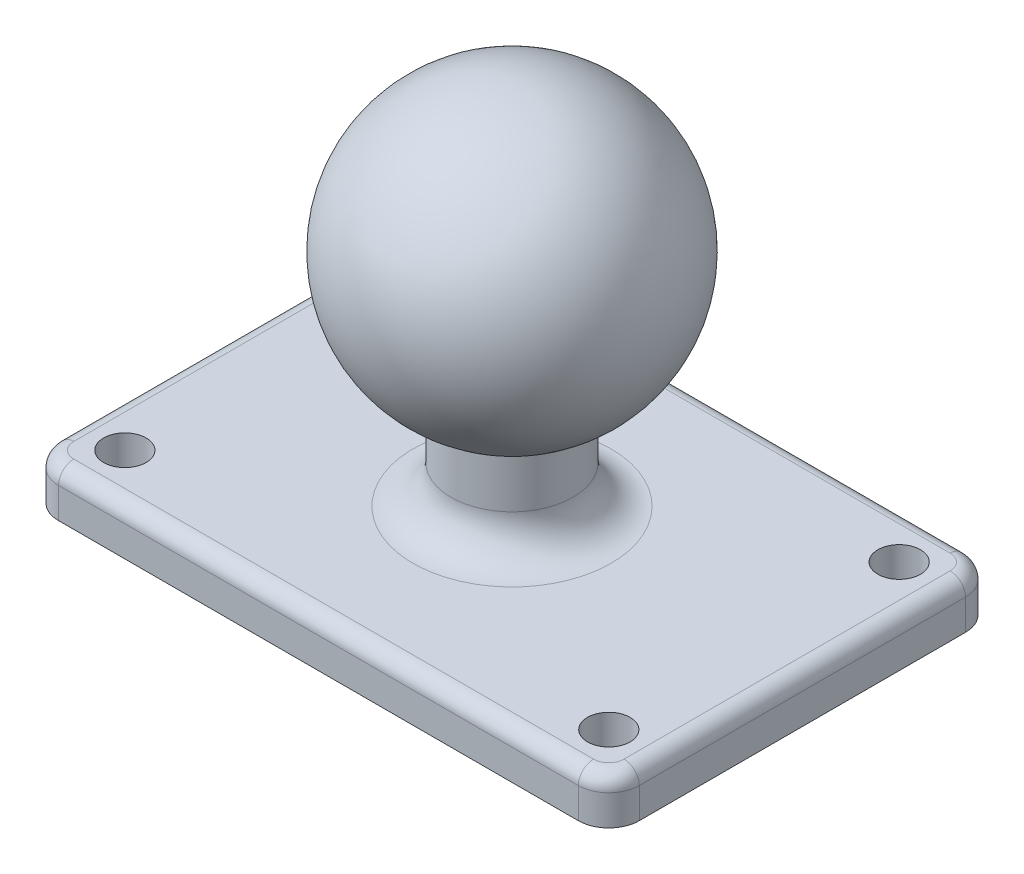
ISO-10303-21;
HEADER;
FILE_DESCRIPTION(('STEP AP214'),'2;1');
FILE_NAME('part.step','',(''),(''),'','','');
FILE_SCHEMA(('AUTOMOTIVE_DESIGN { 1 0 10303 214 1 1 1 1 }'));
ENDSEC;
DATA;
#1=APPLICATION_CONTEXT('core data for automotive mechanical design processes');
#2=APPLICATION_PROTOCOL_DEFINITION('international standard','automotive_design',2000,#1);
#3=PRODUCT_CONTEXT('',#1,'mechanical');
#4=PRODUCT('Part','Part','',(#3));
#5=PRODUCT_RELATED_PRODUCT_CATEGORY('part','',(#4));
#6=PRODUCT_DEFINITION_FORMATION('','',#4);
#7=PRODUCT_DEFINITION_CONTEXT('part definition',#1,'design');
#8=PRODUCT_DEFINITION('design','',#6,#7);
#9=PRODUCT_DEFINITION_SHAPE('','',#8);
#10=(LENGTH_UNIT() NAMED_UNIT(*) SI_UNIT(.MILLI.,.METRE.));
#11=(NAMED_UNIT(*) PLANE_ANGLE_UNIT() SI_UNIT($,.RADIAN.));
#12=(NAMED_UNIT(*) SI_UNIT($,.STERADIAN.) SOLID_ANGLE_UNIT());
#13=UNCERTAINTY_MEASURE_WITH_UNIT(LENGTH_MEASURE(1.E-05),#10,'distance_accuracy_value','');
#14=(GEOMETRIC_REPRESENTATION_CONTEXT(3) GLOBAL_UNCERTAINTY_ASSIGNED_CONTEXT((#13)) GLOBAL_UNIT_ASSIGNED_CONTEXT((#10,
#11,#12)) REPRESENTATION_CONTEXT('',''));
#15=CARTESIAN_POINT('',(0.,0.,0.));
#16=DIRECTION('',(0.,0.,1.));
#17=DIRECTION('',(1.,0.,0.));
#18=AXIS2_PLACEMENT_3D('',#15,#16,#17);
#19=CARTESIAN_POINT('',(34.1,6.,-21.4));
#20=DIRECTION('',(0.,-1.,0.));
#21=DIRECTION('',(0.,0.,-1.));
#22=AXIS2_PLACEMENT_3D('',#19,#20,#21);
#23=PLANE('',#22);
#24=DIRECTION('',(0.,0.,1.));
#25=VECTOR('',#24,1.);
#26=CARTESIAN_POINT('',(-36.1,6.,-21.4));
#27=LINE('',#26,#25);
#28=CARTESIAN_POINT('',(-36.1,6.,-21.4));
#29=VERTEX_POINT('',#28);
#30=CARTESIAN_POINT('',(-36.1,6.,21.4));
#31=VERTEX_POINT('',#30);
#32=EDGE_CURVE('E204',#29,#31,#27,.T.);
#33=ORIENTED_EDGE('',*,*,#32,.T.);
#34=CARTESIAN_POINT('',(-34.1,6.,21.4));
#35=DIRECTION('',(0.,-1.,0.));
#36=DIRECTION('',(0.,0.,-1.));
#37=AXIS2_PLACEMENT_3D('',#34,#35,#36);
#38=CIRCLE('',#37,2.);
#39=CARTESIAN_POINT('',(-34.1,6.,23.4));
#40=VERTEX_POINT('',#39);
#41=EDGE_CURVE('E206',#31,#40,#38,.F.);
#42=ORIENTED_EDGE('',*,*,#41,.T.);
#43=DIRECTION('',(1.,0.,0.));
#44=VECTOR('',#43,1.);
#45=CARTESIAN_POINT('',(34.1,6.,23.4));
#46=LINE('',#45,#44);
#47=CARTESIAN_POINT('',(34.1,6.,23.4));
#48=VERTEX_POINT('',#47);
#49=EDGE_CURVE('E192',#40,#48,#46,.T.);
#50=ORIENTED_EDGE('',*,*,#49,.T.);
#51=CARTESIAN_POINT('',(34.1,6.,21.4));
#52=DIRECTION('',(0.,-1.,0.));
#53=DIRECTION('',(0.,0.,-1.));
#54=AXIS2_PLACEMENT_3D('',#51,#52,#53);
#55=CIRCLE('',#54,2.);
#56=CARTESIAN_POINT('',(36.1,6.,21.4));
#57=VERTEX_POINT('',#56);
#58=EDGE_CURVE('E194',#48,#57,#55,.F.);
#59=ORIENTED_EDGE('',*,*,#58,.T.);
#60=DIRECTION('',(0.,0.,-1.));
#61=VECTOR('',#60,1.);
#62=CARTESIAN_POINT('',(36.1,6.,-21.4));
#63=LINE('',#62,#61);
#64=CARTESIAN_POINT('',(36.1,6.,-21.4));
#65=VERTEX_POINT('',#64);
#66=EDGE_CURVE('E196',#57,#65,#63,.T.);
#67=ORIENTED_EDGE('',*,*,#66,.T.);
#68=CARTESIAN_POINT('',(34.1,6.,-21.4));
#69=DIRECTION('',(0.,-1.,0.));
#70=DIRECTION('',(0.,0.,-1.));
#71=AXIS2_PLACEMENT_3D('',#68,#69,#70);
#72=CIRCLE('',#71,2.);
#73=CARTESIAN_POINT('',(34.1,6.,-23.4));
#74=VERTEX_POINT('',#73);
#75=EDGE_CURVE('E198',#65,#74,#72,.F.);
#76=ORIENTED_EDGE('',*,*,#75,.T.);
#77=DIRECTION('',(-1.,0.,0.));
#78=VECTOR('',#77,1.);
#79=CARTESIAN_POINT('',(34.1,6.,-23.4));
#80=LINE('',#79,#78);
#81=CARTESIAN_POINT('',(-34.1,6.,-23.4));
#82=VERTEX_POINT('',#81);
#83=EDGE_CURVE('E200',#74,#82,#80,.T.);
#84=ORIENTED_EDGE('',*,*,#83,.T.);
#85=CARTESIAN_POINT('',(-34.1,6.,-21.4));
#86=DIRECTION('',(0.,-1.,0.));
#87=DIRECTION('',(0.,0.,-1.));
#88=AXIS2_PLACEMENT_3D('',#85,#86,#87);
#89=CIRCLE('',#88,2.);
#90=EDGE_CURVE('E202',#82,#29,#89,.F.);
#91=ORIENTED_EDGE('',*,*,#90,.T.);
#92=EDGE_LOOP('',(#33,#42,#50,#59,#67,#76,#84,#91));
#93=FACE_BOUND('',#92,.T.);
#94=CARTESIAN_POINT('',(0.,6.,0.));
#95=DIRECTION('',(0.,-1.,0.));
#96=DIRECTION('',(0.,0.,-1.));
#97=AXIS2_PLACEMENT_3D('',#94,#95,#96);
#98=CIRCLE('',#97,13.);
#99=CARTESIAN_POINT('',(0.,6.,-13.));
#100=VERTEX_POINT('',#99);
#101=EDGE_CURVE('E189',#100,#100,#98,.T.);
#102=ORIENTED_EDGE('',*,*,#101,.T.);
#103=EDGE_LOOP('',(#102));
#104=FACE_BOUND('',#103,.T.);
#105=CARTESIAN_POINT('',(-31.75,6.,-19.05));
#106=DIRECTION('',(0.,1.,0.));
#107=DIRECTION('',(0.,0.,1.));
#108=AXIS2_PLACEMENT_3D('',#105,#106,#107);
#109=CIRCLE('',#108,2.794);
#110=CARTESIAN_POINT('',(-31.75,6.,-16.256));
#111=VERTEX_POINT('',#110);
#112=EDGE_CURVE('E153',#111,#111,#109,.T.);
#113=ORIENTED_EDGE('',*,*,#112,.F.);
#114=EDGE_LOOP('',(#113));
#115=FACE_BOUND('',#114,.T.);
#116=CARTESIAN_POINT('',(31.75,6.,-19.05));
#117=DIRECTION('',(0.,1.,0.));
#118=DIRECTION('',(0.,0.,1.));
#119=AXIS2_PLACEMENT_3D('',#116,#117,#118);
#120=CIRCLE('',#119,2.794);
#121=CARTESIAN_POINT('',(31.75,6.,-16.256));
#122=VERTEX_POINT('',#121);
#123=EDGE_CURVE('E264',#122,#122,#120,.T.);
#124=ORIENTED_EDGE('',*,*,#123,.F.);
#125=EDGE_LOOP('',(#124));
#126=FACE_BOUND('',#125,.T.);
#127=CARTESIAN_POINT('',(31.75,6.,19.05));
#128=DIRECTION('',(0.,1.,0.));
#129=DIRECTION('',(0.,0.,1.));
#130=AXIS2_PLACEMENT_3D('',#127,#128,#129);
#131=CIRCLE('',#130,2.794);
#132=CARTESIAN_POINT('',(31.75,6.,21.844));
#133=VERTEX_POINT('',#132);
#134=EDGE_CURVE('E258',#133,#133,#131,.T.);
#135=ORIENTED_EDGE('',*,*,#134,.F.);
#136=EDGE_LOOP('',(#135));
#137=FACE_BOUND('',#136,.T.);
#138=CARTESIAN_POINT('',(-31.75,6.,19.05));
#139=DIRECTION('',(0.,1.,0.));
#140=DIRECTION('',(0.,0.,1.));
#141=AXIS2_PLACEMENT_3D('',#138,#139,#140);
#142=CIRCLE('',#141,2.794);
#143=CARTESIAN_POINT('',(-31.75,6.,21.844));
#144=VERTEX_POINT('',#143);
#145=EDGE_CURVE('E252',#144,#144,#142,.T.);
#146=ORIENTED_EDGE('',*,*,#145,.F.);
#147=EDGE_LOOP('',(#146));
#148=FACE_BOUND('',#147,.T.);
#149=ADVANCED_FACE('F36',(#93,#104,#115,#126,#137,#148),#23,.F.);
#150=CARTESIAN_POINT('',(34.1,0.,-21.4));
#151=DIRECTION('',(0.,-1.,0.));
#152=DIRECTION('',(0.,0.,-1.));
#153=AXIS2_PLACEMENT_3D('',#150,#151,#152);
#154=PLANE('',#153);
#155=CARTESIAN_POINT('',(31.75,0.,19.05));
#156=DIRECTION('',(0.,1.,0.));
#157=DIRECTION('',(0.,0.,1.));
#158=AXIS2_PLACEMENT_3D('',#155,#156,#157);
#159=CIRCLE('',#158,2.794);
#160=CARTESIAN_POINT('',(31.75,0.,21.844));
#161=VERTEX_POINT('',#160);
#162=EDGE_CURVE('E256',#161,#161,#159,.T.);
#163=ORIENTED_EDGE('',*,*,#162,.T.);
#164=EDGE_LOOP('',(#163));
#165=FACE_BOUND('',#164,.T.);
#166=CARTESIAN_POINT('',(-31.75,0.,-19.05));
#167=DIRECTION('',(0.,1.,0.));
#168=DIRECTION('',(0.,0.,1.));
#169=AXIS2_PLACEMENT_3D('',#166,#167,#168);
#170=CIRCLE('',#169,2.794);
#171=CARTESIAN_POINT('',(-31.75,0.,-16.256));
#172=VERTEX_POINT('',#171);
#173=EDGE_CURVE('E156',#172,#172,#170,.T.);
#174=ORIENTED_EDGE('',*,*,#173,.T.);
#175=EDGE_LOOP('',(#174));
#176=FACE_BOUND('',#175,.T.);
#177=CARTESIAN_POINT('',(34.1,0.,-21.4));
#178=DIRECTION('',(0.,1.,0.));
#179=DIRECTION('',(0.,0.,-1.));
#180=AXIS2_PLACEMENT_3D('',#177,#178,#179);
#181=CIRCLE('',#180,4.);
#182=CARTESIAN_POINT('',(38.1,0.,-21.4));
#183=VERTEX_POINT('',#182);
#184=CARTESIAN_POINT('',(34.1,0.,-25.4));
#185=VERTEX_POINT('',#184);
#186=EDGE_CURVE('E145',#183,#185,#181,.T.);
#187=ORIENTED_EDGE('',*,*,#186,.F.);
#188=DIRECTION('',(0.,0.,-1.));
#189=VECTOR('',#188,1.);
#190=CARTESIAN_POINT('',(38.1,0.,21.4));
#191=LINE('',#190,#189);
#192=CARTESIAN_POINT('',(38.1,0.,21.4));
#193=VERTEX_POINT('',#192);
#194=EDGE_CURVE('E173',#193,#183,#191,.T.);
#195=ORIENTED_EDGE('',*,*,#194,.F.);
#196=CARTESIAN_POINT('',(34.1,0.,21.4));
#197=DIRECTION('',(0.,1.,0.));
#198=DIRECTION('',(0.,0.,-1.));
#199=AXIS2_PLACEMENT_3D('',#196,#197,#198);
#200=CIRCLE('',#199,4.);
#201=CARTESIAN_POINT('',(34.1,0.,25.4));
#202=VERTEX_POINT('',#201);
#203=EDGE_CURVE('E170',#202,#193,#200,.T.);
#204=ORIENTED_EDGE('',*,*,#203,.F.);
#205=DIRECTION('',(1.,0.,0.));
#206=VECTOR('',#205,1.);
#207=CARTESIAN_POINT('',(-34.1,0.,25.4));
#208=LINE('',#207,#206);
#209=CARTESIAN_POINT('',(-34.1,0.,25.4));
#210=VERTEX_POINT('',#209);
#211=EDGE_CURVE('E167',#210,#202,#208,.T.);
#212=ORIENTED_EDGE('',*,*,#211,.F.);
#213=CARTESIAN_POINT('',(-34.1,0.,21.4));
#214=DIRECTION('',(0.,1.,0.));
#215=DIRECTION('',(0.,0.,-1.));
#216=AXIS2_PLACEMENT_3D('',#213,#214,#215);
#217=CIRCLE('',#216,4.);
#218=CARTESIAN_POINT('',(-38.1,0.,21.4));
#219=VERTEX_POINT('',#218);
#220=EDGE_CURVE('E164',#219,#210,#217,.T.);
#221=ORIENTED_EDGE('',*,*,#220,.F.);
#222=DIRECTION('',(0.,0.,1.));
#223=VECTOR('',#222,1.);
#224=CARTESIAN_POINT('',(-38.1,0.,21.4));
#225=LINE('',#224,#223);
#226=CARTESIAN_POINT('',(-38.1,0.,-21.4));
#227=VERTEX_POINT('',#226);
#228=EDGE_CURVE('E161',#227,#219,#225,.T.);
#229=ORIENTED_EDGE('',*,*,#228,.F.);
#230=CARTESIAN_POINT('',(-34.1,0.,-21.4));
#231=DIRECTION('',(0.,1.,0.));
#232=DIRECTION('',(0.,0.,-1.));
#233=AXIS2_PLACEMENT_3D('',#230,#231,#232);
#234=CIRCLE('',#233,4.);
#235=CARTESIAN_POINT('',(-34.1,0.,-25.4));
#236=VERTEX_POINT('',#235);
#237=EDGE_CURVE('E148',#236,#227,#234,.T.);
#238=ORIENTED_EDGE('',*,*,#237,.F.);
#239=DIRECTION('',(-1.,0.,0.));
#240=VECTOR('',#239,1.);
#241=CARTESIAN_POINT('',(-34.1,0.,-25.4));
#242=LINE('',#241,#240);
#243=EDGE_CURVE('E130',#185,#236,#242,.T.);
#244=ORIENTED_EDGE('',*,*,#243,.F.);
#245=EDGE_LOOP('',(#187,#195,#204,#212,#221,#229,#238,#244));
#246=FACE_BOUND('',#245,.T.);
#247=CARTESIAN_POINT('',(31.75,0.,-19.05));
#248=DIRECTION('',(0.,1.,0.));
#249=DIRECTION('',(0.,0.,1.));
#250=AXIS2_PLACEMENT_3D('',#247,#248,#249);
#251=CIRCLE('',#250,2.794);
#252=CARTESIAN_POINT('',(31.75,0.,-16.256));
#253=VERTEX_POINT('',#252);
#254=EDGE_CURVE('E261',#253,#253,#251,.T.);
#255=ORIENTED_EDGE('',*,*,#254,.T.);
#256=EDGE_LOOP('',(#255));
#257=FACE_BOUND('',#256,.T.);
#258=CARTESIAN_POINT('',(-31.75,0.,19.05));
#259=DIRECTION('',(0.,1.,0.));
#260=DIRECTION('',(0.,0.,1.));
#261=AXIS2_PLACEMENT_3D('',#258,#259,#260);
#262=CIRCLE('',#261,2.794);
#263=CARTESIAN_POINT('',(-31.75,0.,21.844));
#264=VERTEX_POINT('',#263);
#265=EDGE_CURVE('E247',#264,#264,#262,.T.);
#266=ORIENTED_EDGE('',*,*,#265,.T.);
#267=EDGE_LOOP('',(#266));
#268=FACE_BOUND('',#267,.T.);
#269=ADVANCED_FACE('F142',(#165,#176,#246,#257,#268),#154,.T.);
#270=CARTESIAN_POINT('',(34.1,6.,-21.4));
#271=DIRECTION('',(0.,-1.,0.));
#272=DIRECTION('',(0.,0.,-1.));
#273=AXIS2_PLACEMENT_3D('',#270,#271,#272);
#274=CYLINDRICAL_SURFACE('',#273,4.);
#275=DIRECTION('',(0.,-1.,0.));
#276=VECTOR('',#275,1.);
#277=CARTESIAN_POINT('',(34.1,6.,-25.4));
#278=LINE('',#277,#276);
#279=CARTESIAN_POINT('',(34.1,4.,-25.4));
#280=VERTEX_POINT('',#279);
#281=EDGE_CURVE('E126',#280,#185,#278,.T.);
#282=ORIENTED_EDGE('',*,*,#281,.F.);
#283=CARTESIAN_POINT('',(34.1,4.,-21.4));
#284=DIRECTION('',(0.,-1.,0.));
#285=DIRECTION('',(0.,0.,-1.));
#286=AXIS2_PLACEMENT_3D('',#283,#284,#285);
#287=CIRCLE('',#286,4.);
#288=CARTESIAN_POINT('',(38.1,4.,-21.4));
#289=VERTEX_POINT('',#288);
#290=EDGE_CURVE('E217',#280,#289,#287,.T.);
#291=ORIENTED_EDGE('',*,*,#290,.T.);
#292=DIRECTION('',(0.,-1.,0.));
#293=VECTOR('',#292,1.);
#294=CARTESIAN_POINT('',(38.1,6.,-21.4));
#295=LINE('',#294,#293);
#296=EDGE_CURVE('E151',#289,#183,#295,.T.);
#297=ORIENTED_EDGE('',*,*,#296,.T.);
#298=ORIENTED_EDGE('',*,*,#186,.T.);
#299=EDGE_LOOP('',(#282,#291,#297,#298));
#300=FACE_BOUND('',#299,.T.);
#301=ADVANCED_FACE('F150',(#300),#274,.T.);
#302=CARTESIAN_POINT('',(-34.1,6.,-25.4));
#303=DIRECTION('',(0.,0.,1.));
#304=DIRECTION('',(1.,0.,0.));
#305=AXIS2_PLACEMENT_3D('',#302,#303,#304);
#306=PLANE('',#305);
#307=DIRECTION('',(0.,-1.,0.));
#308=VECTOR('',#307,1.);
#309=CARTESIAN_POINT('',(-34.1,6.,-25.4));
#310=LINE('',#309,#308);
#311=CARTESIAN_POINT('',(-34.1,4.,-25.4));
#312=VERTEX_POINT('',#311);
#313=EDGE_CURVE('E138',#312,#236,#310,.T.);
#314=ORIENTED_EDGE('',*,*,#313,.F.);
#315=DIRECTION('',(-1.,0.,0.));
#316=VECTOR('',#315,1.);
#317=CARTESIAN_POINT('',(-34.1,4.,-25.4));
#318=LINE('',#317,#316);
#319=EDGE_CURVE('E133',#312,#280,#318,.F.);
#320=ORIENTED_EDGE('',*,*,#319,.T.);
#321=ORIENTED_EDGE('',*,*,#281,.T.);
#322=ORIENTED_EDGE('',*,*,#243,.T.);
#323=EDGE_LOOP('',(#314,#320,#321,#322));
#324=FACE_BOUND('',#323,.T.);
#325=ADVANCED_FACE('F129',(#324),#306,.F.);
#326=CARTESIAN_POINT('',(-34.1,6.,-21.4));
#327=DIRECTION('',(0.,-1.,0.));
#328=DIRECTION('',(0.,0.,-1.));
#329=AXIS2_PLACEMENT_3D('',#326,#327,#328);
#330=CYLINDRICAL_SURFACE('',#329,4.);
#331=DIRECTION('',(0.,-1.,0.));
#332=VECTOR('',#331,1.);
#333=CARTESIAN_POINT('',(-38.1,6.,-21.4));
#334=LINE('',#333,#332);
#335=CARTESIAN_POINT('',(-38.1,4.,-21.4));
#336=VERTEX_POINT('',#335);
#337=EDGE_CURVE('E184',#336,#227,#334,.T.);
#338=ORIENTED_EDGE('',*,*,#337,.F.);
#339=CARTESIAN_POINT('',(-34.1,4.,-21.4));
#340=DIRECTION('',(0.,-1.,0.));
#341=DIRECTION('',(0.,0.,-1.));
#342=AXIS2_PLACEMENT_3D('',#339,#340,#341);
#343=CIRCLE('',#342,4.);
#344=EDGE_CURVE('E214',#336,#312,#343,.T.);
#345=ORIENTED_EDGE('',*,*,#344,.T.);
#346=ORIENTED_EDGE('',*,*,#313,.T.);
#347=ORIENTED_EDGE('',*,*,#237,.T.);
#348=EDGE_LOOP('',(#338,#345,#346,#347));
#349=FACE_BOUND('',#348,.T.);
#350=ADVANCED_FACE('F313',(#349),#330,.T.);
#351=CARTESIAN_POINT('',(-38.1,6.,21.4));
#352=DIRECTION('',(1.,0.,0.));
#353=DIRECTION('',(0.,0.,-1.));
#354=AXIS2_PLACEMENT_3D('',#351,#352,#353);
#355=PLANE('',#354);
#356=DIRECTION('',(0.,-1.,0.));
#357=VECTOR('',#356,1.);
#358=CARTESIAN_POINT('',(-38.1,6.,21.4));
#359=LINE('',#358,#357);
#360=CARTESIAN_POINT('',(-38.1,4.,21.4));
#361=VERTEX_POINT('',#360);
#362=EDGE_CURVE('E182',#361,#219,#359,.T.);
#363=ORIENTED_EDGE('',*,*,#362,.F.);
#364=DIRECTION('',(0.,0.,1.));
#365=VECTOR('',#364,1.);
#366=CARTESIAN_POINT('',(-38.1,4.,21.4));
#367=LINE('',#366,#365);
#368=EDGE_CURVE('E212',#361,#336,#367,.F.);
#369=ORIENTED_EDGE('',*,*,#368,.T.);
#370=ORIENTED_EDGE('',*,*,#337,.T.);
#371=ORIENTED_EDGE('',*,*,#228,.T.);
#372=EDGE_LOOP('',(#363,#369,#370,#371));
#373=FACE_BOUND('',#372,.T.);
#374=ADVANCED_FACE('F309',(#373),#355,.F.);
#375=CARTESIAN_POINT('',(-34.1,6.,21.4));
#376=DIRECTION('',(0.,-1.,0.));
#377=DIRECTION('',(0.,0.,-1.));
#378=AXIS2_PLACEMENT_3D('',#375,#376,#377);
#379=CYLINDRICAL_SURFACE('',#378,4.);
#380=DIRECTION('',(0.,-1.,0.));
#381=VECTOR('',#380,1.);
#382=CARTESIAN_POINT('',(-34.1,6.,25.4));
#383=LINE('',#382,#381);
#384=CARTESIAN_POINT('',(-34.1,4.,25.4));
#385=VERTEX_POINT('',#384);
#386=EDGE_CURVE('E180',#385,#210,#383,.T.);
#387=ORIENTED_EDGE('',*,*,#386,.F.);
#388=CARTESIAN_POINT('',(-34.1,4.,21.4));
#389=DIRECTION('',(0.,-1.,0.));
#390=DIRECTION('',(0.,0.,-1.));
#391=AXIS2_PLACEMENT_3D('',#388,#389,#390);
#392=CIRCLE('',#391,4.);
#393=EDGE_CURVE('E209',#385,#361,#392,.T.);
#394=ORIENTED_EDGE('',*,*,#393,.T.);
#395=ORIENTED_EDGE('',*,*,#362,.T.);
#396=ORIENTED_EDGE('',*,*,#220,.T.);
#397=EDGE_LOOP('',(#387,#394,#395,#396));
#398=FACE_BOUND('',#397,.T.);
#399=ADVANCED_FACE('F305',(#398),#379,.T.);
#400=CARTESIAN_POINT('',(-34.1,6.,25.4));
#401=DIRECTION('',(0.,0.,-1.));
#402=DIRECTION('',(-1.,0.,0.));
#403=AXIS2_PLACEMENT_3D('',#400,#401,#402);
#404=PLANE('',#403);
#405=DIRECTION('',(0.,-1.,0.));
#406=VECTOR('',#405,1.);
#407=CARTESIAN_POINT('',(34.1,6.,25.4));
#408=LINE('',#407,#406);
#409=CARTESIAN_POINT('',(34.1,4.,25.4));
#410=VERTEX_POINT('',#409);
#411=EDGE_CURVE('E178',#410,#202,#408,.T.);
#412=ORIENTED_EDGE('',*,*,#411,.F.);
#413=DIRECTION('',(1.,0.,0.));
#414=VECTOR('',#413,1.);
#415=CARTESIAN_POINT('',(-34.1,4.,25.4));
#416=LINE('',#415,#414);
#417=EDGE_CURVE('E11',#410,#385,#416,.F.);
#418=ORIENTED_EDGE('',*,*,#417,.T.);
#419=ORIENTED_EDGE('',*,*,#386,.T.);
#420=ORIENTED_EDGE('',*,*,#211,.T.);
#421=EDGE_LOOP('',(#412,#418,#419,#420));
#422=FACE_BOUND('',#421,.T.);
#423=ADVANCED_FACE('F302',(#422),#404,.F.);
#424=CARTESIAN_POINT('',(34.1,6.,21.4));
#425=DIRECTION('',(0.,-1.,0.));
#426=DIRECTION('',(0.,0.,-1.));
#427=AXIS2_PLACEMENT_3D('',#424,#425,#426);
#428=CYLINDRICAL_SURFACE('',#427,4.);
#429=DIRECTION('',(0.,-1.,0.));
#430=VECTOR('',#429,1.);
#431=CARTESIAN_POINT('',(38.1,6.,21.4));
#432=LINE('',#431,#430);
#433=CARTESIAN_POINT('',(38.1,4.,21.4));
#434=VERTEX_POINT('',#433);
#435=EDGE_CURVE('E176',#434,#193,#432,.T.);
#436=ORIENTED_EDGE('',*,*,#435,.F.);
#437=CARTESIAN_POINT('',(34.1,4.,21.4));
#438=DIRECTION('',(0.,-1.,0.));
#439=DIRECTION('',(0.,0.,-1.));
#440=AXIS2_PLACEMENT_3D('',#437,#438,#439);
#441=CIRCLE('',#440,4.);
#442=EDGE_CURVE('E45',#434,#410,#441,.T.);
#443=ORIENTED_EDGE('',*,*,#442,.T.);
#444=ORIENTED_EDGE('',*,*,#411,.T.);
#445=ORIENTED_EDGE('',*,*,#203,.T.);
#446=EDGE_LOOP('',(#436,#443,#444,#445));
#447=FACE_BOUND('',#446,.T.);
#448=ADVANCED_FACE('F299',(#447),#428,.T.);
#449=CARTESIAN_POINT('',(38.1,6.,21.4));
#450=DIRECTION('',(-1.,0.,0.));
#451=DIRECTION('',(0.,0.,1.));
#452=AXIS2_PLACEMENT_3D('',#449,#450,#451);
#453=PLANE('',#452);
#454=ORIENTED_EDGE('',*,*,#296,.F.);
#455=DIRECTION('',(0.,0.,-1.));
#456=VECTOR('',#455,1.);
#457=CARTESIAN_POINT('',(38.1,4.,21.4));
#458=LINE('',#457,#456);
#459=EDGE_CURVE('E60',#289,#434,#458,.F.);
#460=ORIENTED_EDGE('',*,*,#459,.T.);
#461=ORIENTED_EDGE('',*,*,#435,.T.);
#462=ORIENTED_EDGE('',*,*,#194,.T.);
#463=EDGE_LOOP('',(#454,#460,#461,#462));
#464=FACE_BOUND('',#463,.T.);
#465=ADVANCED_FACE('F284',(#464),#453,.F.);
#466=CARTESIAN_POINT('',(-31.75,6.,-19.05));
#467=DIRECTION('',(0.,-1.,0.));
#468=DIRECTION('',(0.,0.,-1.));
#469=AXIS2_PLACEMENT_3D('',#466,#467,#468);
#470=CYLINDRICAL_SURFACE('',#469,2.794);
#471=ORIENTED_EDGE('',*,*,#112,.T.);
#472=EDGE_LOOP('',(#471));
#473=FACE_BOUND('',#472,.T.);
#474=ORIENTED_EDGE('',*,*,#173,.F.);
#475=EDGE_LOOP('',(#474));
#476=FACE_BOUND('',#475,.T.);
#477=ADVANCED_FACE('F274',(#473,#476),#470,.F.);
#478=CARTESIAN_POINT('',(31.75,6.,-19.05));
#479=DIRECTION('',(0.,-1.,0.));
#480=DIRECTION('',(0.,0.,-1.));
#481=AXIS2_PLACEMENT_3D('',#478,#479,#480);
#482=CYLINDRICAL_SURFACE('',#481,2.794);
#483=ORIENTED_EDGE('',*,*,#123,.T.);
#484=EDGE_LOOP('',(#483));
#485=FACE_BOUND('',#484,.T.);
#486=ORIENTED_EDGE('',*,*,#254,.F.);
#487=EDGE_LOOP('',(#486));
#488=FACE_BOUND('',#487,.T.);
#489=ADVANCED_FACE('F271',(#485,#488),#482,.F.);
#490=CARTESIAN_POINT('',(31.75,6.,19.05));
#491=DIRECTION('',(0.,-1.,0.));
#492=DIRECTION('',(0.,0.,-1.));
#493=AXIS2_PLACEMENT_3D('',#490,#491,#492);
#494=CYLINDRICAL_SURFACE('',#493,2.794);
#495=ORIENTED_EDGE('',*,*,#134,.T.);
#496=EDGE_LOOP('',(#495));
#497=FACE_BOUND('',#496,.T.);
#498=ORIENTED_EDGE('',*,*,#162,.F.);
#499=EDGE_LOOP('',(#498));
#500=FACE_BOUND('',#499,.T.);
#501=ADVANCED_FACE('F273',(#497,#500),#494,.F.);
#502=CARTESIAN_POINT('',(-31.75,6.,19.05));
#503=DIRECTION('',(0.,-1.,0.));
#504=DIRECTION('',(0.,0.,-1.));
#505=AXIS2_PLACEMENT_3D('',#502,#503,#504);
#506=CYLINDRICAL_SURFACE('',#505,2.794);
#507=ORIENTED_EDGE('',*,*,#145,.T.);
#508=EDGE_LOOP('',(#507));
#509=FACE_BOUND('',#508,.T.);
#510=ORIENTED_EDGE('',*,*,#265,.F.);
#511=EDGE_LOOP('',(#510));
#512=FACE_BOUND('',#511,.T.);
#513=ADVANCED_FACE('F281',(#509,#512),#506,.F.);
#514=CARTESIAN_POINT('',(0.,34.9727969506267,0.));
#515=DIRECTION('',(0.,-1.,0.));
#516=DIRECTION('',(1.,0.,0.));
#517=AXIS2_PLACEMENT_3D('',#514,#515,#516);
#518=SPHERICAL_SURFACE('',#517,19.05);
#519=CARTESIAN_POINT('',(0.,17.684,0.));
#520=DIRECTION('',(0.,-1.,0.));
#521=DIRECTION('',(1.,0.,0.));
#522=AXIS2_PLACEMENT_3D('',#519,#520,#521);
#523=CIRCLE('',#522,8.00000000000001);
#524=CARTESIAN_POINT('',(8.00000000000003,17.684,0.));
#525=VERTEX_POINT('',#524);
#526=EDGE_CURVE('E242',#525,#525,#523,.T.);
#527=ORIENTED_EDGE('',*,*,#526,.F.);
#528=EDGE_LOOP('',(#527));
#529=FACE_BOUND('',#528,.T.);
#530=ADVANCED_FACE('F391',(#529),#518,.T.);
#531=CARTESIAN_POINT('',(0.,6.,0.));
#532=DIRECTION('',(0.,-1.,0.));
#533=DIRECTION('',(1.,0.,0.));
#534=AXIS2_PLACEMENT_3D('',#531,#532,#533);
#535=CYLINDRICAL_SURFACE('',#534,8.00000000000002);
#536=CARTESIAN_POINT('',(0.,11.,0.));
#537=DIRECTION('',(0.,-1.,0.));
#538=DIRECTION('',(0.,0.,-1.));
#539=AXIS2_PLACEMENT_3D('',#536,#537,#538);
#540=CIRCLE('',#539,8.00000000000002);
#541=CARTESIAN_POINT('',(0.,11.,-8.00000000000002));
#542=VERTEX_POINT('',#541);
#543=EDGE_CURVE('E137',#542,#542,#540,.F.);
#544=ORIENTED_EDGE('',*,*,#543,.T.);
#545=EDGE_LOOP('',(#544));
#546=FACE_BOUND('',#545,.T.);
#547=ORIENTED_EDGE('',*,*,#526,.T.);
#548=EDGE_LOOP('',(#547));
#549=FACE_BOUND('',#548,.T.);
#550=ADVANCED_FACE('F325',(#546,#549),#535,.T.);
#551=CARTESIAN_POINT('',(0.,11.,0.));
#552=DIRECTION('',(0.,-1.,0.));
#553=DIRECTION('',(0.,0.,-1.));
#554=AXIS2_PLACEMENT_3D('',#551,#552,#553);
#555=TOROIDAL_SURFACE('',#554,13.,5.);
#556=ORIENTED_EDGE('',*,*,#101,.F.);
#557=EDGE_LOOP('',(#556));
#558=FACE_BOUND('',#557,.T.);
#559=ORIENTED_EDGE('',*,*,#543,.F.);
#560=EDGE_LOOP('',(#559));
#561=FACE_BOUND('',#560,.T.);
#562=ADVANCED_FACE('F322',(#558,#561),#555,.F.);
#563=CARTESIAN_POINT('',(34.1,4.,-21.4));
#564=DIRECTION('',(0.,-1.,0.));
#565=DIRECTION('',(0.,0.,-1.));
#566=AXIS2_PLACEMENT_3D('',#563,#564,#565);
#567=TOROIDAL_SURFACE('',#566,2.,2.);
#568=CARTESIAN_POINT('',(36.1,4.,-21.4));
#569=DIRECTION('',(0.,0.,1.));
#570=DIRECTION('',(1.,0.,0.));
#571=AXIS2_PLACEMENT_3D('',#568,#569,#570);
#572=CIRCLE('',#571,2.);
#573=EDGE_CURVE('E236',#289,#65,#572,.T.);
#574=ORIENTED_EDGE('',*,*,#573,.F.);
#575=ORIENTED_EDGE('',*,*,#290,.F.);
#576=CARTESIAN_POINT('',(34.1,4.,-23.4));
#577=DIRECTION('',(-1.,0.,0.));
#578=DIRECTION('',(0.,0.,1.));
#579=AXIS2_PLACEMENT_3D('',#576,#577,#578);
#580=CIRCLE('',#579,2.);
#581=EDGE_CURVE('E40',#74,#280,#580,.T.);
#582=ORIENTED_EDGE('',*,*,#581,.F.);
#583=ORIENTED_EDGE('',*,*,#75,.F.);
#584=EDGE_LOOP('',(#574,#575,#582,#583));
#585=FACE_BOUND('',#584,.T.);
#586=ADVANCED_FACE('F38',(#585),#567,.T.);
#587=CARTESIAN_POINT('',(34.1,4.,-23.4));
#588=DIRECTION('',(-1.,0.,0.));
#589=DIRECTION('',(0.,0.,1.));
#590=AXIS2_PLACEMENT_3D('',#587,#588,#589);
#591=CYLINDRICAL_SURFACE('',#590,2.);
#592=ORIENTED_EDGE('',*,*,#581,.T.);
#593=ORIENTED_EDGE('',*,*,#319,.F.);
#594=CARTESIAN_POINT('',(-34.1,4.,-23.4));
#595=DIRECTION('',(-1.,0.,0.));
#596=DIRECTION('',(0.,0.,1.));
#597=AXIS2_PLACEMENT_3D('',#594,#595,#596);
#598=CIRCLE('',#597,2.);
#599=EDGE_CURVE('E234',#82,#312,#598,.T.);
#600=ORIENTED_EDGE('',*,*,#599,.F.);
#601=ORIENTED_EDGE('',*,*,#83,.F.);
#602=EDGE_LOOP('',(#592,#593,#600,#601));
#603=FACE_BOUND('',#602,.T.);
#604=ADVANCED_FACE('F349',(#603),#591,.T.);
#605=CARTESIAN_POINT('',(36.1,4.,-21.4));
#606=DIRECTION('',(0.,0.,-1.));
#607=DIRECTION('',(-1.,0.,0.));
#608=AXIS2_PLACEMENT_3D('',#605,#606,#607);
#609=CYLINDRICAL_SURFACE('',#608,2.);
#610=ORIENTED_EDGE('',*,*,#573,.T.);
#611=ORIENTED_EDGE('',*,*,#66,.F.);
#612=CARTESIAN_POINT('',(36.1,4.,21.4));
#613=DIRECTION('',(0.,0.,1.));
#614=DIRECTION('',(1.,0.,0.));
#615=AXIS2_PLACEMENT_3D('',#612,#613,#614);
#616=CIRCLE('',#615,2.);
#617=EDGE_CURVE('E231',#434,#57,#616,.T.);
#618=ORIENTED_EDGE('',*,*,#617,.F.);
#619=ORIENTED_EDGE('',*,*,#459,.F.);
#620=EDGE_LOOP('',(#610,#611,#618,#619));
#621=FACE_BOUND('',#620,.T.);
#622=ADVANCED_FACE('F346',(#621),#609,.T.);
#623=CARTESIAN_POINT('',(-34.1,4.,-21.4));
#624=DIRECTION('',(0.,-1.,0.));
#625=DIRECTION('',(0.,0.,-1.));
#626=AXIS2_PLACEMENT_3D('',#623,#624,#625);
#627=TOROIDAL_SURFACE('',#626,2.,2.);
#628=ORIENTED_EDGE('',*,*,#599,.T.);
#629=ORIENTED_EDGE('',*,*,#344,.F.);
#630=CARTESIAN_POINT('',(-36.1,4.,-21.4));
#631=DIRECTION('',(0.,0.,1.));
#632=DIRECTION('',(1.,0.,0.));
#633=AXIS2_PLACEMENT_3D('',#630,#631,#632);
#634=CIRCLE('',#633,2.);
#635=EDGE_CURVE('E228',#29,#336,#634,.T.);
#636=ORIENTED_EDGE('',*,*,#635,.F.);
#637=ORIENTED_EDGE('',*,*,#90,.F.);
#638=EDGE_LOOP('',(#628,#629,#636,#637));
#639=FACE_BOUND('',#638,.T.);
#640=ADVANCED_FACE('F342',(#639),#627,.T.);
#641=CARTESIAN_POINT('',(34.1,4.,21.4));
#642=DIRECTION('',(0.,-1.,0.));
#643=DIRECTION('',(0.,0.,-1.));
#644=AXIS2_PLACEMENT_3D('',#641,#642,#643);
#645=TOROIDAL_SURFACE('',#644,2.,2.);
#646=ORIENTED_EDGE('',*,*,#617,.T.);
#647=ORIENTED_EDGE('',*,*,#58,.F.);
#648=CARTESIAN_POINT('',(34.1,4.,23.4));
#649=DIRECTION('',(-1.,0.,0.));
#650=DIRECTION('',(0.,0.,1.));
#651=AXIS2_PLACEMENT_3D('',#648,#649,#650);
#652=CIRCLE('',#651,2.);
#653=EDGE_CURVE('E225',#410,#48,#652,.T.);
#654=ORIENTED_EDGE('',*,*,#653,.F.);
#655=ORIENTED_EDGE('',*,*,#442,.F.);
#656=EDGE_LOOP('',(#646,#647,#654,#655));
#657=FACE_BOUND('',#656,.T.);
#658=ADVANCED_FACE('F338',(#657),#645,.T.);
#659=CARTESIAN_POINT('',(-36.1,4.,-21.4));
#660=DIRECTION('',(0.,0.,1.));
#661=DIRECTION('',(1.,0.,0.));
#662=AXIS2_PLACEMENT_3D('',#659,#660,#661);
#663=CYLINDRICAL_SURFACE('',#662,2.);
#664=ORIENTED_EDGE('',*,*,#635,.T.);
#665=ORIENTED_EDGE('',*,*,#368,.F.);
#666=CARTESIAN_POINT('',(-36.1,4.,21.4));
#667=DIRECTION('',(0.,0.,1.));
#668=DIRECTION('',(1.,0.,0.));
#669=AXIS2_PLACEMENT_3D('',#666,#667,#668);
#670=CIRCLE('',#669,2.);
#671=EDGE_CURVE('E223',#31,#361,#670,.T.);
#672=ORIENTED_EDGE('',*,*,#671,.F.);
#673=ORIENTED_EDGE('',*,*,#32,.F.);
#674=EDGE_LOOP('',(#664,#665,#672,#673));
#675=FACE_BOUND('',#674,.T.);
#676=ADVANCED_FACE('F334',(#675),#663,.T.);
#677=CARTESIAN_POINT('',(34.1,4.,23.4));
#678=DIRECTION('',(1.,0.,0.));
#679=DIRECTION('',(0.,0.,-1.));
#680=AXIS2_PLACEMENT_3D('',#677,#678,#679);
#681=CYLINDRICAL_SURFACE('',#680,2.);
#682=ORIENTED_EDGE('',*,*,#653,.T.);
#683=ORIENTED_EDGE('',*,*,#49,.F.);
#684=CARTESIAN_POINT('',(-34.1,4.,23.4));
#685=DIRECTION('',(-1.,0.,0.));
#686=DIRECTION('',(0.,-1.,0.));
#687=AXIS2_PLACEMENT_3D('',#684,#685,#686);
#688=CIRCLE('',#687,2.);
#689=EDGE_CURVE('E221',#385,#40,#688,.T.);
#690=ORIENTED_EDGE('',*,*,#689,.F.);
#691=ORIENTED_EDGE('',*,*,#417,.F.);
#692=EDGE_LOOP('',(#682,#683,#690,#691));
#693=FACE_BOUND('',#692,.T.);
#694=ADVANCED_FACE('F330',(#693),#681,.T.);
#695=CARTESIAN_POINT('',(-34.1,4.,21.4));
#696=DIRECTION('',(0.,-1.,0.));
#697=DIRECTION('',(0.,0.,-1.));
#698=AXIS2_PLACEMENT_3D('',#695,#696,#697);
#699=TOROIDAL_SURFACE('',#698,2.,2.);
#700=ORIENTED_EDGE('',*,*,#671,.T.);
#701=ORIENTED_EDGE('',*,*,#393,.F.);
#702=ORIENTED_EDGE('',*,*,#689,.T.);
#703=ORIENTED_EDGE('',*,*,#41,.F.);
#704=EDGE_LOOP('',(#700,#701,#702,#703));
#705=FACE_BOUND('',#704,.T.);
#706=ADVANCED_FACE('F327',(#705),#699,.T.);
#707=CLOSED_SHELL('',(#149,#269,#301,#325,#350,#374,#399,#423,#448,#465,#477,#489,#501,#513,
#530,#550,#562,#586,#604,#622,#640,#658,#676,#694,#706));
#708=MANIFOLD_SOLID_BREP('B2',#707);
#709=ADVANCED_BREP_SHAPE_REPRESENTATION('',(#18,#708),#14);
#710=SHAPE_DEFINITION_REPRESENTATION(#9,#709);
ENDSEC;
END-ISO-10303-21;
